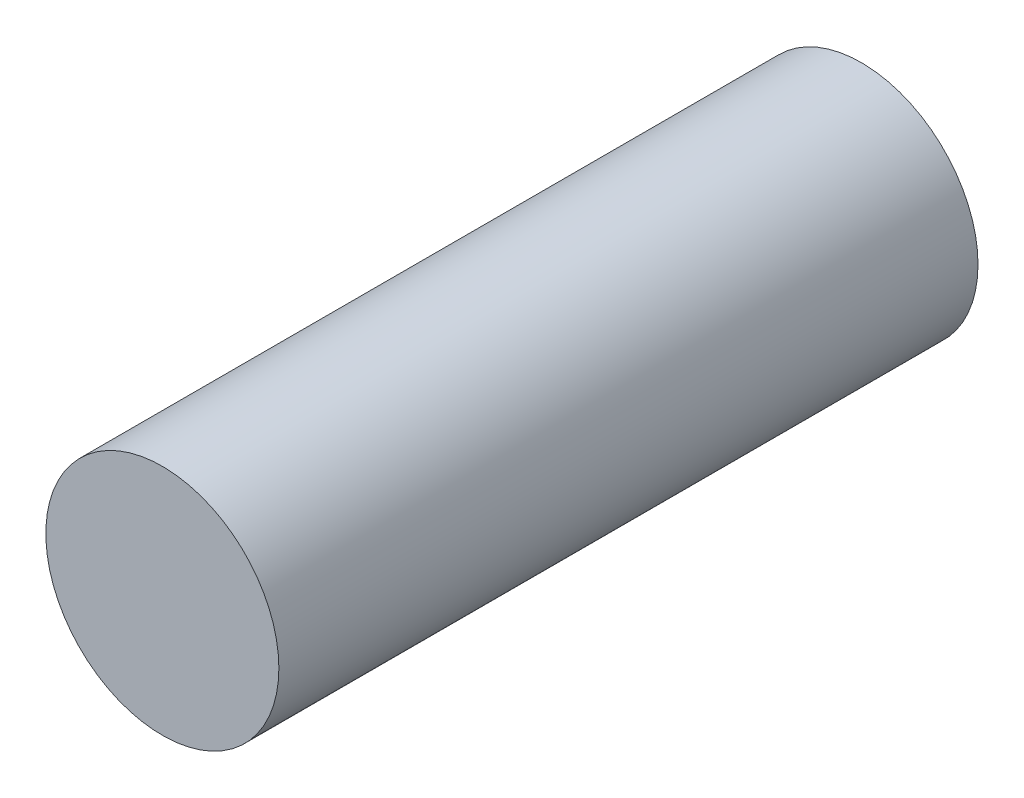
ISO-10303-21;
HEADER;
FILE_DESCRIPTION(('STEP AP214'),'2;1');
FILE_NAME('part.step','',(''),(''),'','','');
FILE_SCHEMA(('AUTOMOTIVE_DESIGN { 1 0 10303 214 1 1 1 1 }'));
ENDSEC;
DATA;
#1=APPLICATION_CONTEXT('core data for automotive mechanical design processes');
#2=APPLICATION_PROTOCOL_DEFINITION('international standard','automotive_design',2000,#1);
#3=PRODUCT_CONTEXT('',#1,'mechanical');
#4=PRODUCT('Part','Part','',(#3));
#5=PRODUCT_RELATED_PRODUCT_CATEGORY('part','',(#4));
#6=PRODUCT_DEFINITION_FORMATION('','',#4);
#7=PRODUCT_DEFINITION_CONTEXT('part definition',#1,'design');
#8=PRODUCT_DEFINITION('design','',#6,#7);
#9=PRODUCT_DEFINITION_SHAPE('','',#8);
#10=(LENGTH_UNIT() NAMED_UNIT(*) SI_UNIT(.MILLI.,.METRE.));
#11=(NAMED_UNIT(*) PLANE_ANGLE_UNIT() SI_UNIT($,.RADIAN.));
#12=(NAMED_UNIT(*) SI_UNIT($,.STERADIAN.) SOLID_ANGLE_UNIT());
#13=UNCERTAINTY_MEASURE_WITH_UNIT(LENGTH_MEASURE(1.E-05),#10,'distance_accuracy_value','');
#14=(GEOMETRIC_REPRESENTATION_CONTEXT(3) GLOBAL_UNCERTAINTY_ASSIGNED_CONTEXT((#13)) GLOBAL_UNIT_ASSIGNED_CONTEXT((#10,
#11,#12)) REPRESENTATION_CONTEXT('',''));
#15=CARTESIAN_POINT('',(0.,0.,0.));
#16=DIRECTION('',(0.,0.,1.));
#17=DIRECTION('',(1.,0.,0.));
#18=AXIS2_PLACEMENT_3D('',#15,#16,#17);
#19=CARTESIAN_POINT('',(0.,0.,39.9));
#20=DIRECTION('',(0.,0.,-1.));
#21=DIRECTION('',(-1.,0.,0.));
#22=AXIS2_PLACEMENT_3D('',#19,#20,#21);
#23=CYLINDRICAL_SURFACE('',#22,6.65);
#24=CARTESIAN_POINT('',(0.,0.,39.9));
#25=DIRECTION('',(0.,0.,1.));
#26=DIRECTION('',(1.,0.,0.));
#27=AXIS2_PLACEMENT_3D('',#24,#25,#26);
#28=CIRCLE('',#27,6.65);
#29=CARTESIAN_POINT('',(6.65,0.,39.9));
#30=VERTEX_POINT('',#29);
#31=EDGE_CURVE('E10',#30,#30,#28,.T.);
#32=ORIENTED_EDGE('',*,*,#31,.F.);
#33=EDGE_LOOP('',(#32));
#34=FACE_BOUND('',#33,.T.);
#35=CARTESIAN_POINT('',(0.,0.,0.));
#36=DIRECTION('',(0.,0.,1.));
#37=DIRECTION('',(1.,0.,0.));
#38=AXIS2_PLACEMENT_3D('',#35,#36,#37);
#39=CIRCLE('',#38,6.65);
#40=CARTESIAN_POINT('',(6.65,0.,0.));
#41=VERTEX_POINT('',#40);
#42=EDGE_CURVE('E45',#41,#41,#39,.T.);
#43=ORIENTED_EDGE('',*,*,#42,.T.);
#44=EDGE_LOOP('',(#43));
#45=FACE_BOUND('',#44,.T.);
#46=ADVANCED_FACE('F39',(#34,#45),#23,.T.);
#47=CARTESIAN_POINT('',(0.,0.,39.9));
#48=DIRECTION('',(0.,0.,1.));
#49=DIRECTION('',(1.,0.,0.));
#50=AXIS2_PLACEMENT_3D('',#47,#48,#49);
#51=PLANE('',#50);
#52=ORIENTED_EDGE('',*,*,#31,.T.);
#53=EDGE_LOOP('',(#52));
#54=FACE_BOUND('',#53,.T.);
#55=ADVANCED_FACE('F53',(#54),#51,.T.);
#56=CARTESIAN_POINT('',(0.,0.,0.));
#57=DIRECTION('',(0.,0.,1.));
#58=DIRECTION('',(1.,0.,0.));
#59=AXIS2_PLACEMENT_3D('',#56,#57,#58);
#60=PLANE('',#59);
#61=ORIENTED_EDGE('',*,*,#42,.F.);
#62=EDGE_LOOP('',(#61));
#63=FACE_BOUND('',#62,.T.);
#64=ADVANCED_FACE('F55',(#63),#60,.F.);
#65=CLOSED_SHELL('',(#46,#55,#64));
#66=MANIFOLD_SOLID_BREP('B2',#65);
#67=ADVANCED_BREP_SHAPE_REPRESENTATION('',(#18,#66),#14);
#68=SHAPE_DEFINITION_REPRESENTATION(#9,#67);
ENDSEC;
END-ISO-10303-21;
